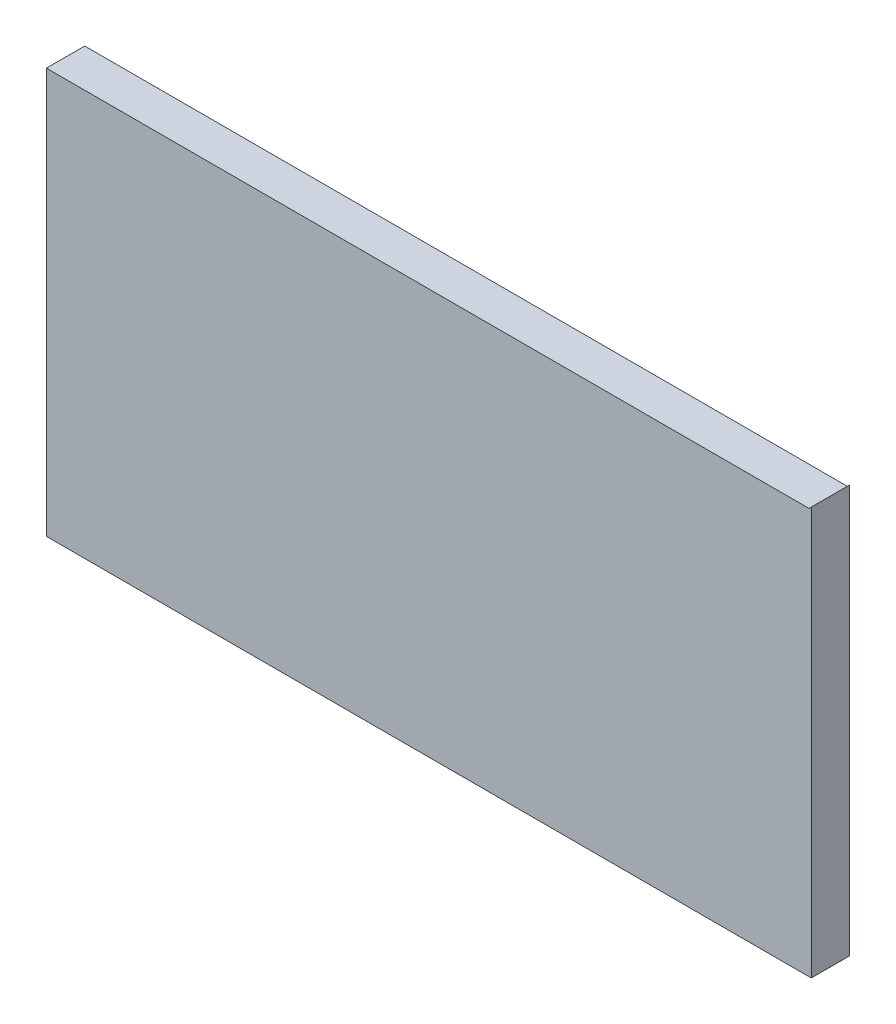
ISO-10303-21;
HEADER;
FILE_DESCRIPTION(('STEP AP214'),'2;1');
FILE_NAME('part.step','',(''),(''),'','','');
FILE_SCHEMA(('AUTOMOTIVE_DESIGN { 1 0 10303 214 1 1 1 1 }'));
ENDSEC;
DATA;
#1=APPLICATION_CONTEXT('core data for automotive mechanical design processes');
#2=APPLICATION_PROTOCOL_DEFINITION('international standard','automotive_design',2000,#1);
#3=PRODUCT_CONTEXT('',#1,'mechanical');
#4=PRODUCT('Part','Part','',(#3));
#5=PRODUCT_RELATED_PRODUCT_CATEGORY('part','',(#4));
#6=PRODUCT_DEFINITION_FORMATION('','',#4);
#7=PRODUCT_DEFINITION_CONTEXT('part definition',#1,'design');
#8=PRODUCT_DEFINITION('design','',#6,#7);
#9=PRODUCT_DEFINITION_SHAPE('','',#8);
#10=(LENGTH_UNIT() NAMED_UNIT(*) SI_UNIT(.MILLI.,.METRE.));
#11=(NAMED_UNIT(*) PLANE_ANGLE_UNIT() SI_UNIT($,.RADIAN.));
#12=(NAMED_UNIT(*) SI_UNIT($,.STERADIAN.) SOLID_ANGLE_UNIT());
#13=UNCERTAINTY_MEASURE_WITH_UNIT(LENGTH_MEASURE(1.E-05),#10,'distance_accuracy_value','');
#14=(GEOMETRIC_REPRESENTATION_CONTEXT(3) GLOBAL_UNCERTAINTY_ASSIGNED_CONTEXT((#13)) GLOBAL_UNIT_ASSIGNED_CONTEXT((#10,
#11,#12)) REPRESENTATION_CONTEXT('',''));
#15=CARTESIAN_POINT('',(0.,0.,0.));
#16=DIRECTION('',(0.,0.,1.));
#17=DIRECTION('',(1.,0.,0.));
#18=AXIS2_PLACEMENT_3D('',#15,#16,#17);
#19=CARTESIAN_POINT('',(-4.98905022,-2.65999976,0.499999));
#20=DIRECTION('',(0.,0.,1.));
#21=DIRECTION('',(1.,0.,0.));
#22=AXIS2_PLACEMENT_3D('',#19,#20,#21);
#23=PLANE('',#22);
#24=DIRECTION('',(-1.,0.,0.));
#25=VECTOR('',#24,1.);
#26=CARTESIAN_POINT('',(4.98905022,-2.65999976,0.499999));
#27=LINE('',#26,#25);
#28=CARTESIAN_POINT('',(4.98905022,-2.65999976,0.499999));
#29=VERTEX_POINT('',#28);
#30=CARTESIAN_POINT('',(-4.98905022,-2.65999976,0.499999));
#31=VERTEX_POINT('',#30);
#32=EDGE_CURVE('E26',#29,#31,#27,.T.);
#33=ORIENTED_EDGE('',*,*,#32,.F.);
#34=DIRECTION('',(0.,-1.,0.));
#35=VECTOR('',#34,1.);
#36=CARTESIAN_POINT('',(4.98905022,2.65999976,0.499999));
#37=LINE('',#36,#35);
#38=CARTESIAN_POINT('',(4.98905022,2.65999976,0.499999));
#39=VERTEX_POINT('',#38);
#40=EDGE_CURVE('E77',#39,#29,#37,.T.);
#41=ORIENTED_EDGE('',*,*,#40,.F.);
#42=DIRECTION('',(0.707106781187048,0.707106781186048,0.));
#43=VECTOR('',#42,1.);
#44=CARTESIAN_POINT('',(4.95905028,2.62999982,0.499999));
#45=LINE('',#44,#43);
#46=CARTESIAN_POINT('',(4.95905028,2.62999982,0.499999));
#47=VERTEX_POINT('',#46);
#48=EDGE_CURVE('E80',#47,#39,#45,.T.);
#49=ORIENTED_EDGE('',*,*,#48,.F.);
#50=DIRECTION('',(1.,0.,0.));
#51=VECTOR('',#50,1.);
#52=CARTESIAN_POINT('',(-4.98905022,2.62999982,0.499999));
#53=LINE('',#52,#51);
#54=CARTESIAN_POINT('',(-4.98905022,2.62999982,0.499999));
#55=VERTEX_POINT('',#54);
#56=EDGE_CURVE('E116',#55,#47,#53,.T.);
#57=ORIENTED_EDGE('',*,*,#56,.F.);
#58=DIRECTION('',(0.,1.,0.));
#59=VECTOR('',#58,1.);
#60=CARTESIAN_POINT('',(-4.98905022,-2.65999976,0.499999));
#61=LINE('',#60,#59);
#62=EDGE_CURVE('E120',#31,#55,#61,.T.);
#63=ORIENTED_EDGE('',*,*,#62,.F.);
#64=EDGE_LOOP('',(#33,#41,#49,#57,#63));
#65=FACE_BOUND('',#64,.T.);
#66=ADVANCED_FACE('F16',(#65),#23,.T.);
#67=CARTESIAN_POINT('',(-4.98905022,-2.65999976,0.));
#68=DIRECTION('',(0.,0.,1.));
#69=DIRECTION('',(1.,0.,0.));
#70=AXIS2_PLACEMENT_3D('',#67,#68,#69);
#71=PLANE('',#70);
#72=DIRECTION('',(0.,1.,0.));
#73=VECTOR('',#72,1.);
#74=CARTESIAN_POINT('',(-4.98905022,-2.65999976,0.));
#75=LINE('',#74,#73);
#76=CARTESIAN_POINT('',(-4.98905022,-2.65999976,0.));
#77=VERTEX_POINT('',#76);
#78=CARTESIAN_POINT('',(-4.98905022,2.62999982,0.));
#79=VERTEX_POINT('',#78);
#80=EDGE_CURVE('E112',#77,#79,#75,.T.);
#81=ORIENTED_EDGE('',*,*,#80,.T.);
#82=DIRECTION('',(1.,0.,0.));
#83=VECTOR('',#82,1.);
#84=CARTESIAN_POINT('',(-4.98905022,2.62999982,0.));
#85=LINE('',#84,#83);
#86=CARTESIAN_POINT('',(4.95905028,2.62999982,0.));
#87=VERTEX_POINT('',#86);
#88=EDGE_CURVE('E99',#79,#87,#85,.T.);
#89=ORIENTED_EDGE('',*,*,#88,.T.);
#90=DIRECTION('',(0.707106781187048,0.707106781186048,0.));
#91=VECTOR('',#90,1.);
#92=CARTESIAN_POINT('',(4.95905028,2.62999982,0.));
#93=LINE('',#92,#91);
#94=CARTESIAN_POINT('',(4.98905022,2.65999976,0.));
#95=VERTEX_POINT('',#94);
#96=EDGE_CURVE('E86',#87,#95,#93,.T.);
#97=ORIENTED_EDGE('',*,*,#96,.T.);
#98=DIRECTION('',(0.,-1.,0.));
#99=VECTOR('',#98,1.);
#100=CARTESIAN_POINT('',(4.98905022,2.65999976,0.));
#101=LINE('',#100,#99);
#102=CARTESIAN_POINT('',(4.98905022,-2.65999976,0.));
#103=VERTEX_POINT('',#102);
#104=EDGE_CURVE('E20',#95,#103,#101,.T.);
#105=ORIENTED_EDGE('',*,*,#104,.T.);
#106=DIRECTION('',(-1.,0.,0.));
#107=VECTOR('',#106,1.);
#108=CARTESIAN_POINT('',(4.98905022,-2.65999976,0.));
#109=LINE('',#108,#107);
#110=EDGE_CURVE('E11',#103,#77,#109,.T.);
#111=ORIENTED_EDGE('',*,*,#110,.T.);
#112=EDGE_LOOP('',(#81,#89,#97,#105,#111));
#113=FACE_BOUND('',#112,.T.);
#114=ADVANCED_FACE('F137',(#113),#71,.F.);
#115=CARTESIAN_POINT('',(4.98905022,-2.65999976,0.));
#116=DIRECTION('',(0.,-1.,0.));
#117=DIRECTION('',(0.,0.,-1.));
#118=AXIS2_PLACEMENT_3D('',#115,#116,#117);
#119=PLANE('',#118);
#120=DIRECTION('',(0.,0.,1.));
#121=VECTOR('',#120,1.);
#122=CARTESIAN_POINT('',(4.98905022,-2.65999976,0.));
#123=LINE('',#122,#121);
#124=EDGE_CURVE('E85',#103,#29,#123,.T.);
#125=ORIENTED_EDGE('',*,*,#124,.T.);
#126=ORIENTED_EDGE('',*,*,#32,.T.);
#127=DIRECTION('',(0.,0.,1.));
#128=VECTOR('',#127,1.);
#129=CARTESIAN_POINT('',(-4.98905022,-2.65999976,0.));
#130=LINE('',#129,#128);
#131=EDGE_CURVE('E108',#77,#31,#130,.T.);
#132=ORIENTED_EDGE('',*,*,#131,.F.);
#133=ORIENTED_EDGE('',*,*,#110,.F.);
#134=EDGE_LOOP('',(#125,#126,#132,#133));
#135=FACE_BOUND('',#134,.T.);
#136=ADVANCED_FACE('F139',(#135),#119,.T.);
#137=CARTESIAN_POINT('',(4.98905022,2.65999976,0.));
#138=DIRECTION('',(1.,0.,0.));
#139=DIRECTION('',(0.,1.,0.));
#140=AXIS2_PLACEMENT_3D('',#137,#138,#139);
#141=PLANE('',#140);
#142=DIRECTION('',(0.,0.,1.));
#143=VECTOR('',#142,1.);
#144=CARTESIAN_POINT('',(4.98905022,2.65999976,0.));
#145=LINE('',#144,#143);
#146=EDGE_CURVE('E89',#95,#39,#145,.T.);
#147=ORIENTED_EDGE('',*,*,#146,.T.);
#148=ORIENTED_EDGE('',*,*,#40,.T.);
#149=ORIENTED_EDGE('',*,*,#124,.F.);
#150=ORIENTED_EDGE('',*,*,#104,.F.);
#151=EDGE_LOOP('',(#147,#148,#149,#150));
#152=FACE_BOUND('',#151,.T.);
#153=ADVANCED_FACE('F90',(#152),#141,.T.);
#154=CARTESIAN_POINT('',(4.95905028,2.62999982,0.));
#155=DIRECTION('',(-0.707106781186048,0.707106781187048,0.));
#156=DIRECTION('',(0.,0.,1.));
#157=AXIS2_PLACEMENT_3D('',#154,#155,#156);
#158=PLANE('',#157);
#159=DIRECTION('',(0.,0.,1.));
#160=VECTOR('',#159,1.);
#161=CARTESIAN_POINT('',(4.95905028,2.62999982,0.));
#162=LINE('',#161,#160);
#163=EDGE_CURVE('E96',#87,#47,#162,.T.);
#164=ORIENTED_EDGE('',*,*,#163,.T.);
#165=ORIENTED_EDGE('',*,*,#48,.T.);
#166=ORIENTED_EDGE('',*,*,#146,.F.);
#167=ORIENTED_EDGE('',*,*,#96,.F.);
#168=EDGE_LOOP('',(#164,#165,#166,#167));
#169=FACE_BOUND('',#168,.T.);
#170=ADVANCED_FACE('F18',(#169),#158,.T.);
#171=CARTESIAN_POINT('',(-4.98905022,2.62999982,0.));
#172=DIRECTION('',(0.,1.,0.));
#173=DIRECTION('',(1.,0.,0.));
#174=AXIS2_PLACEMENT_3D('',#171,#172,#173);
#175=PLANE('',#174);
#176=DIRECTION('',(0.,0.,1.));
#177=VECTOR('',#176,1.);
#178=CARTESIAN_POINT('',(-4.98905022,2.62999982,0.));
#179=LINE('',#178,#177);
#180=EDGE_CURVE('E117',#79,#55,#179,.T.);
#181=ORIENTED_EDGE('',*,*,#180,.T.);
#182=ORIENTED_EDGE('',*,*,#56,.T.);
#183=ORIENTED_EDGE('',*,*,#163,.F.);
#184=ORIENTED_EDGE('',*,*,#88,.F.);
#185=EDGE_LOOP('',(#181,#182,#183,#184));
#186=FACE_BOUND('',#185,.T.);
#187=ADVANCED_FACE('F156',(#186),#175,.T.);
#188=CARTESIAN_POINT('',(-4.98905022,-2.65999976,0.));
#189=DIRECTION('',(-1.,0.,0.));
#190=DIRECTION('',(0.,0.,1.));
#191=AXIS2_PLACEMENT_3D('',#188,#189,#190);
#192=PLANE('',#191);
#193=ORIENTED_EDGE('',*,*,#131,.T.);
#194=ORIENTED_EDGE('',*,*,#62,.T.);
#195=ORIENTED_EDGE('',*,*,#180,.F.);
#196=ORIENTED_EDGE('',*,*,#80,.F.);
#197=EDGE_LOOP('',(#193,#194,#195,#196));
#198=FACE_BOUND('',#197,.T.);
#199=ADVANCED_FACE('F154',(#198),#192,.T.);
#200=CLOSED_SHELL('',(#66,#114,#136,#153,#170,#187,#199));
#201=MANIFOLD_SOLID_BREP('B1',#200);
#202=ADVANCED_BREP_SHAPE_REPRESENTATION('',(#18,#201),#14);
#203=SHAPE_DEFINITION_REPRESENTATION(#9,#202);
ENDSEC;
END-ISO-10303-21;
